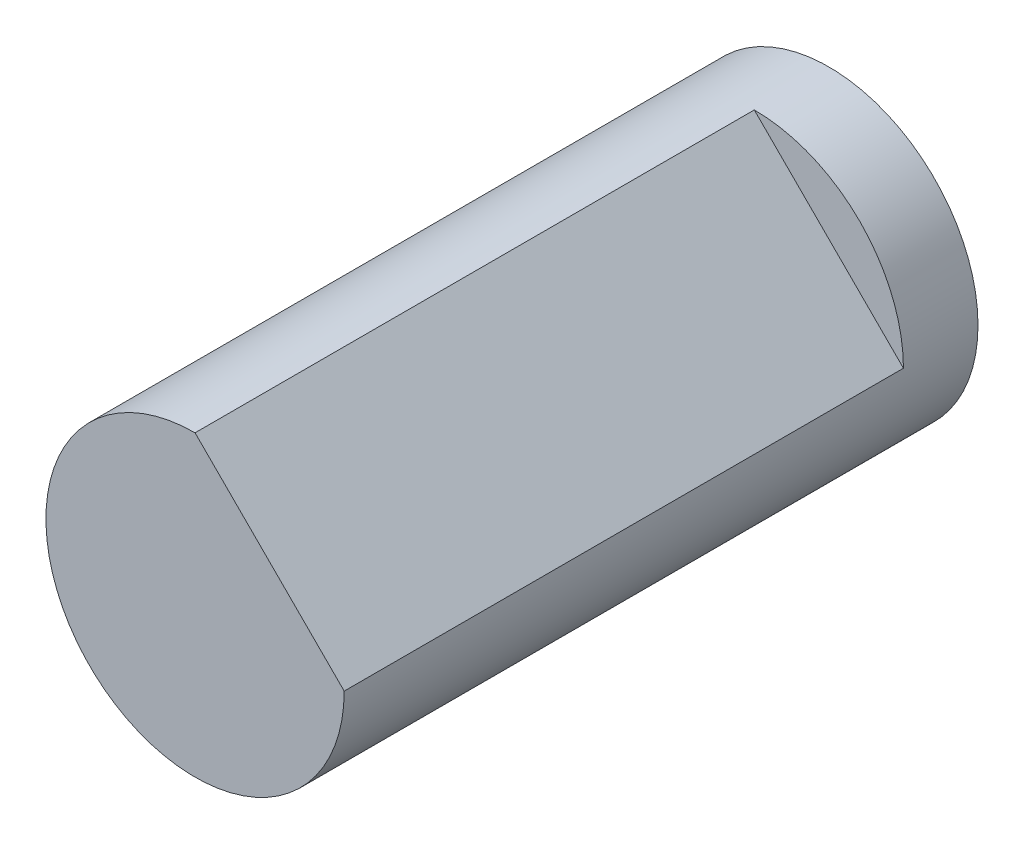
ISO-10303-21;
HEADER;
FILE_DESCRIPTION(('STEP AP214'),'2;1');
FILE_NAME('part.step','',(''),(''),'','','');
FILE_SCHEMA(('AUTOMOTIVE_DESIGN { 1 0 10303 214 1 1 1 1 }'));
ENDSEC;
DATA;
#1=APPLICATION_CONTEXT('core data for automotive mechanical design processes');
#2=APPLICATION_PROTOCOL_DEFINITION('international standard','automotive_design',2000,#1);
#3=PRODUCT_CONTEXT('',#1,'mechanical');
#4=PRODUCT('Part','Part','',(#3));
#5=PRODUCT_RELATED_PRODUCT_CATEGORY('part','',(#4));
#6=PRODUCT_DEFINITION_FORMATION('','',#4);
#7=PRODUCT_DEFINITION_CONTEXT('part definition',#1,'design');
#8=PRODUCT_DEFINITION('design','',#6,#7);
#9=PRODUCT_DEFINITION_SHAPE('','',#8);
#10=(LENGTH_UNIT() NAMED_UNIT(*) SI_UNIT(.MILLI.,.METRE.));
#11=(NAMED_UNIT(*) PLANE_ANGLE_UNIT() SI_UNIT($,.RADIAN.));
#12=(NAMED_UNIT(*) SI_UNIT($,.STERADIAN.) SOLID_ANGLE_UNIT());
#13=UNCERTAINTY_MEASURE_WITH_UNIT(LENGTH_MEASURE(1.E-05),#10,'distance_accuracy_value','');
#14=(GEOMETRIC_REPRESENTATION_CONTEXT(3) GLOBAL_UNCERTAINTY_ASSIGNED_CONTEXT((#13)) GLOBAL_UNIT_ASSIGNED_CONTEXT((#10,
#11,#12)) REPRESENTATION_CONTEXT('',''));
#15=CARTESIAN_POINT('',(0.,0.,0.));
#16=DIRECTION('',(0.,0.,1.));
#17=DIRECTION('',(1.,0.,0.));
#18=AXIS2_PLACEMENT_3D('',#15,#16,#17);
#19=CARTESIAN_POINT('',(0.,0.,17.));
#20=DIRECTION('',(0.,0.,-1.));
#21=DIRECTION('',(-1.,0.,0.));
#22=AXIS2_PLACEMENT_3D('',#19,#20,#21);
#23=CYLINDRICAL_SURFACE('',#22,4.);
#24=CARTESIAN_POINT('',(0.,0.,17.));
#25=DIRECTION('',(0.,0.,1.));
#26=DIRECTION('',(1.,0.,0.));
#27=AXIS2_PLACEMENT_3D('',#24,#25,#26);
#28=CIRCLE('',#27,4.);
#29=CARTESIAN_POINT('',(0.,4.,17.));
#30=VERTEX_POINT('',#29);
#31=CARTESIAN_POINT('',(4.,0.,17.));
#32=VERTEX_POINT('',#31);
#33=EDGE_CURVE('E43',#30,#32,#28,.T.);
#34=ORIENTED_EDGE('',*,*,#33,.F.);
#35=DIRECTION('',(0.,0.,1.));
#36=VECTOR('',#35,1.);
#37=CARTESIAN_POINT('',(0.,4.,2.));
#38=LINE('',#37,#36);
#39=CARTESIAN_POINT('',(0.,4.,2.));
#40=VERTEX_POINT('',#39);
#41=EDGE_CURVE('E50',#40,#30,#38,.T.);
#42=ORIENTED_EDGE('',*,*,#41,.F.);
#43=CARTESIAN_POINT('',(0.,0.,2.));
#44=DIRECTION('',(0.,0.,1.));
#45=DIRECTION('',(1.,0.,0.));
#46=AXIS2_PLACEMENT_3D('',#43,#44,#45);
#47=CIRCLE('',#46,4.);
#48=CARTESIAN_POINT('',(4.,0.,2.));
#49=VERTEX_POINT('',#48);
#50=EDGE_CURVE('E11',#49,#40,#47,.T.);
#51=ORIENTED_EDGE('',*,*,#50,.F.);
#52=DIRECTION('',(0.,0.,1.));
#53=VECTOR('',#52,1.);
#54=CARTESIAN_POINT('',(4.,0.,2.));
#55=LINE('',#54,#53);
#56=EDGE_CURVE('E56',#49,#32,#55,.T.);
#57=ORIENTED_EDGE('',*,*,#56,.T.);
#58=EDGE_LOOP('',(#34,#42,#51,#57));
#59=FACE_BOUND('',#58,.T.);
#60=CARTESIAN_POINT('',(0.,0.,0.));
#61=DIRECTION('',(0.,0.,1.));
#62=DIRECTION('',(1.,0.,0.));
#63=AXIS2_PLACEMENT_3D('',#60,#61,#62);
#64=CIRCLE('',#63,4.);
#65=CARTESIAN_POINT('',(4.,0.,0.));
#66=VERTEX_POINT('',#65);
#67=EDGE_CURVE('E70',#66,#66,#64,.T.);
#68=ORIENTED_EDGE('',*,*,#67,.T.);
#69=EDGE_LOOP('',(#68));
#70=FACE_BOUND('',#69,.T.);
#71=ADVANCED_FACE('F36',(#59,#70),#23,.T.);
#72=CARTESIAN_POINT('',(0.,0.,17.));
#73=DIRECTION('',(0.,0.,1.));
#74=DIRECTION('',(1.,0.,0.));
#75=AXIS2_PLACEMENT_3D('',#72,#73,#74);
#76=PLANE('',#75);
#77=DIRECTION('',(0.707106781186548,-0.707106781186548,0.));
#78=VECTOR('',#77,1.);
#79=CARTESIAN_POINT('',(4.,0.,17.));
#80=LINE('',#79,#78);
#81=EDGE_CURVE('E60',#30,#32,#80,.T.);
#82=ORIENTED_EDGE('',*,*,#81,.F.);
#83=ORIENTED_EDGE('',*,*,#33,.T.);
#84=EDGE_LOOP('',(#82,#83));
#85=FACE_BOUND('',#84,.T.);
#86=ADVANCED_FACE('F72',(#85),#76,.T.);
#87=CARTESIAN_POINT('',(0.,0.,0.));
#88=DIRECTION('',(0.,0.,1.));
#89=DIRECTION('',(1.,0.,0.));
#90=AXIS2_PLACEMENT_3D('',#87,#88,#89);
#91=PLANE('',#90);
#92=ORIENTED_EDGE('',*,*,#67,.F.);
#93=EDGE_LOOP('',(#92));
#94=FACE_BOUND('',#93,.T.);
#95=ADVANCED_FACE('F80',(#94),#91,.F.);
#96=CARTESIAN_POINT('',(0.,0.,2.));
#97=DIRECTION('',(0.,0.,1.));
#98=DIRECTION('',(1.,0.,0.));
#99=AXIS2_PLACEMENT_3D('',#96,#97,#98);
#100=PLANE('',#99);
#101=ORIENTED_EDGE('',*,*,#50,.T.);
#102=DIRECTION('',(0.707106781186548,-0.707106781186548,0.));
#103=VECTOR('',#102,1.);
#104=CARTESIAN_POINT('',(4.,0.,2.));
#105=LINE('',#104,#103);
#106=EDGE_CURVE('E65',#40,#49,#105,.T.);
#107=ORIENTED_EDGE('',*,*,#106,.T.);
#108=EDGE_LOOP('',(#101,#107));
#109=FACE_BOUND('',#108,.T.);
#110=ADVANCED_FACE('F78',(#109),#100,.T.);
#111=CARTESIAN_POINT('',(4.,0.,2.));
#112=DIRECTION('',(-0.707106781186547,-0.707106781186547,0.));
#113=DIRECTION('',(0.707106781186548,-0.707106781186548,0.));
#114=AXIS2_PLACEMENT_3D('',#111,#112,#113);
#115=PLANE('',#114);
#116=ORIENTED_EDGE('',*,*,#81,.T.);
#117=ORIENTED_EDGE('',*,*,#56,.F.);
#118=ORIENTED_EDGE('',*,*,#106,.F.);
#119=ORIENTED_EDGE('',*,*,#41,.T.);
#120=EDGE_LOOP('',(#116,#117,#118,#119));
#121=FACE_BOUND('',#120,.T.);
#122=ADVANCED_FACE('F61',(#121),#115,.F.);
#123=CLOSED_SHELL('',(#71,#86,#95,#110,#122));
#124=MANIFOLD_SOLID_BREP('B2',#123);
#125=ADVANCED_BREP_SHAPE_REPRESENTATION('',(#18,#124),#14);
#126=SHAPE_DEFINITION_REPRESENTATION(#9,#125);
ENDSEC;
END-ISO-10303-21;
